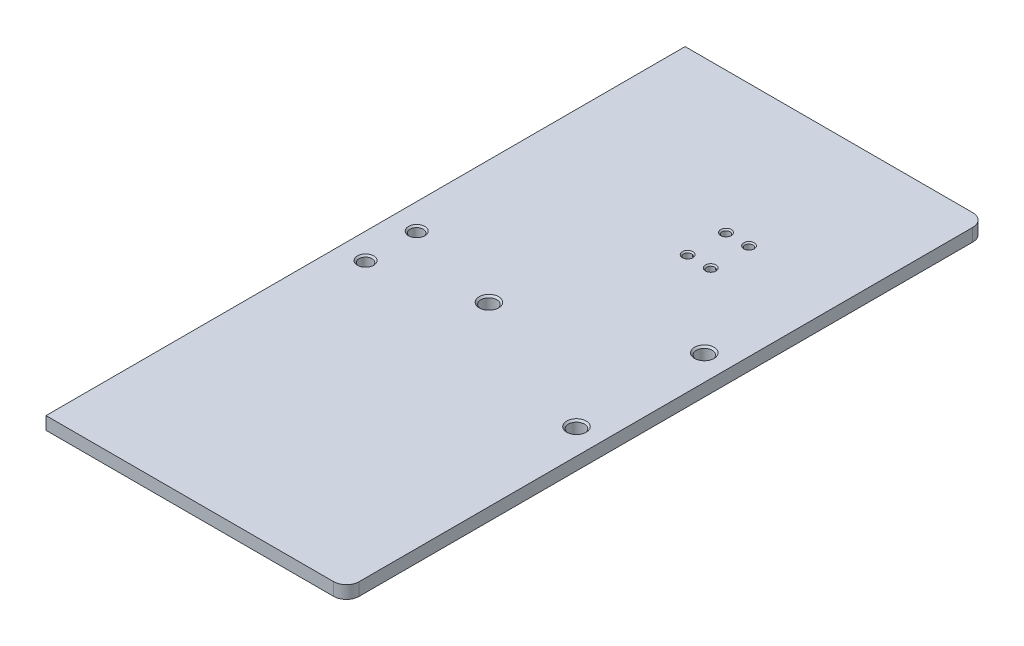
ISO-10303-21;
HEADER;
FILE_DESCRIPTION(('STEP AP214'),'2;1');
FILE_NAME('part.step','',(''),(''),'','','');
FILE_SCHEMA(('AUTOMOTIVE_DESIGN { 1 0 10303 214 1 1 1 1 }'));
ENDSEC;
DATA;
#1=APPLICATION_CONTEXT('core data for automotive mechanical design processes');
#2=APPLICATION_PROTOCOL_DEFINITION('international standard','automotive_design',2000,#1);
#3=PRODUCT_CONTEXT('',#1,'mechanical');
#4=PRODUCT('Part','Part','',(#3));
#5=PRODUCT_RELATED_PRODUCT_CATEGORY('part','',(#4));
#6=PRODUCT_DEFINITION_FORMATION('','',#4);
#7=PRODUCT_DEFINITION_CONTEXT('part definition',#1,'design');
#8=PRODUCT_DEFINITION('design','',#6,#7);
#9=PRODUCT_DEFINITION_SHAPE('','',#8);
#10=(LENGTH_UNIT() NAMED_UNIT(*) SI_UNIT(.MILLI.,.METRE.));
#11=(NAMED_UNIT(*) PLANE_ANGLE_UNIT() SI_UNIT($,.RADIAN.));
#12=(NAMED_UNIT(*) SI_UNIT($,.STERADIAN.) SOLID_ANGLE_UNIT());
#13=UNCERTAINTY_MEASURE_WITH_UNIT(LENGTH_MEASURE(1.E-05),#10,'distance_accuracy_value','');
#14=(GEOMETRIC_REPRESENTATION_CONTEXT(3) GLOBAL_UNCERTAINTY_ASSIGNED_CONTEXT((#13)) GLOBAL_UNIT_ASSIGNED_CONTEXT((#10,
#11,#12)) REPRESENTATION_CONTEXT('',''));
#15=CARTESIAN_POINT('',(0.,0.,0.));
#16=DIRECTION('',(0.,0.,1.));
#17=DIRECTION('',(1.,0.,0.));
#18=AXIS2_PLACEMENT_3D('',#15,#16,#17);
#19=CARTESIAN_POINT('',(0.,0.,0.));
#20=DIRECTION('',(0.,-1.,0.));
#21=DIRECTION('',(0.,0.,-1.));
#22=AXIS2_PLACEMENT_3D('',#19,#20,#21);
#23=PLANE('',#22);
#24=CARTESIAN_POINT('',(-18.,0.,-4.));
#25=DIRECTION('',(0.,1.,0.));
#26=DIRECTION('',(0.,0.,1.));
#27=AXIS2_PLACEMENT_3D('',#24,#25,#26);
#28=CIRCLE('',#27,1.02499999999999);
#29=CARTESIAN_POINT('',(-18.,0.,-2.97500000000001));
#30=VERTEX_POINT('',#29);
#31=EDGE_CURVE('E278',#30,#30,#28,.T.);
#32=ORIENTED_EDGE('',*,*,#31,.T.);
#33=EDGE_LOOP('',(#32));
#34=FACE_BOUND('',#33,.T.);
#35=CARTESIAN_POINT('',(-18.,0.,4.));
#36=DIRECTION('',(0.,1.,0.));
#37=DIRECTION('',(0.,0.,1.));
#38=AXIS2_PLACEMENT_3D('',#35,#36,#37);
#39=CIRCLE('',#38,1.02499999999999);
#40=CARTESIAN_POINT('',(-18.,0.,5.02499999999999));
#41=VERTEX_POINT('',#40);
#42=EDGE_CURVE('E164',#41,#41,#39,.T.);
#43=ORIENTED_EDGE('',*,*,#42,.T.);
#44=EDGE_LOOP('',(#43));
#45=FACE_BOUND('',#44,.T.);
#46=DIRECTION('',(0.,0.,-1.));
#47=VECTOR('',#46,1.);
#48=CARTESIAN_POINT('',(-22.,0.,50.));
#49=LINE('',#48,#47);
#50=CARTESIAN_POINT('',(-22.,0.,50.));
#51=VERTEX_POINT('',#50);
#52=CARTESIAN_POINT('',(-22.,0.,-50.));
#53=VERTEX_POINT('',#52);
#54=EDGE_CURVE('E110',#51,#53,#49,.T.);
#55=ORIENTED_EDGE('',*,*,#54,.T.);
#56=DIRECTION('',(-1.,0.,0.));
#57=VECTOR('',#56,1.);
#58=CARTESIAN_POINT('',(-25.,0.,-50.));
#59=LINE('',#58,#57);
#60=CARTESIAN_POINT('',(23.,0.,-50.));
#61=VERTEX_POINT('',#60);
#62=EDGE_CURVE('E161',#61,#53,#59,.T.);
#63=ORIENTED_EDGE('',*,*,#62,.F.);
#64=CARTESIAN_POINT('',(23.,0.,-48.));
#65=DIRECTION('',(0.,-1.,0.));
#66=DIRECTION('',(0.,0.,-1.));
#67=AXIS2_PLACEMENT_3D('',#64,#65,#66);
#68=CIRCLE('',#67,2.);
#69=CARTESIAN_POINT('',(25.,0.,-48.));
#70=VERTEX_POINT('',#69);
#71=EDGE_CURVE('E183',#61,#70,#68,.T.);
#72=ORIENTED_EDGE('',*,*,#71,.T.);
#73=DIRECTION('',(0.,0.,-1.));
#74=VECTOR('',#73,1.);
#75=CARTESIAN_POINT('',(25.,0.,50.));
#76=LINE('',#75,#74);
#77=CARTESIAN_POINT('',(25.,0.,48.));
#78=VERTEX_POINT('',#77);
#79=EDGE_CURVE('E170',#78,#70,#76,.T.);
#80=ORIENTED_EDGE('',*,*,#79,.F.);
#81=CARTESIAN_POINT('',(23.,0.,48.));
#82=DIRECTION('',(0.,-1.,0.));
#83=DIRECTION('',(0.,0.,-1.));
#84=AXIS2_PLACEMENT_3D('',#81,#82,#83);
#85=CIRCLE('',#84,2.);
#86=CARTESIAN_POINT('',(23.,0.,50.));
#87=VERTEX_POINT('',#86);
#88=EDGE_CURVE('E181',#78,#87,#85,.T.);
#89=ORIENTED_EDGE('',*,*,#88,.T.);
#90=DIRECTION('',(1.,0.,0.));
#91=VECTOR('',#90,1.);
#92=CARTESIAN_POINT('',(-25.,0.,50.));
#93=LINE('',#92,#91);
#94=EDGE_CURVE('E163',#51,#87,#93,.T.);
#95=ORIENTED_EDGE('',*,*,#94,.F.);
#96=EDGE_LOOP('',(#55,#63,#72,#80,#89,#95));
#97=FACE_BOUND('',#96,.T.);
#98=CARTESIAN_POINT('',(6.40000000000001,0.,-22.));
#99=DIRECTION('',(0.,1.,0.));
#100=DIRECTION('',(0.,0.,1.));
#101=AXIS2_PLACEMENT_3D('',#98,#99,#100);
#102=CIRCLE('',#101,0.624999999999999);
#103=CARTESIAN_POINT('',(6.40000000000001,0.,-21.375));
#104=VERTEX_POINT('',#103);
#105=EDGE_CURVE('E260',#104,#104,#102,.T.);
#106=ORIENTED_EDGE('',*,*,#105,.T.);
#107=EDGE_LOOP('',(#106));
#108=FACE_BOUND('',#107,.T.);
#109=CARTESIAN_POINT('',(21.,0.,10.));
#110=DIRECTION('',(0.,-1.,0.));
#111=DIRECTION('',(0.,0.,-1.));
#112=AXIS2_PLACEMENT_3D('',#109,#110,#111);
#113=CIRCLE('',#112,1.24999999999999);
#114=CARTESIAN_POINT('',(21.,0.,8.75000000000001));
#115=VERTEX_POINT('',#114);
#116=EDGE_CURVE('E206',#115,#115,#113,.T.);
#117=ORIENTED_EDGE('',*,*,#116,.F.);
#118=EDGE_LOOP('',(#117));
#119=FACE_BOUND('',#118,.T.);
#120=CARTESIAN_POINT('',(21.,0.,-10.));
#121=DIRECTION('',(0.,-1.,0.));
#122=DIRECTION('',(0.,0.,-1.));
#123=AXIS2_PLACEMENT_3D('',#120,#121,#122);
#124=CIRCLE('',#123,1.24999999999999);
#125=CARTESIAN_POINT('',(21.,0.,-11.25));
#126=VERTEX_POINT('',#125);
#127=EDGE_CURVE('E215',#126,#126,#124,.T.);
#128=ORIENTED_EDGE('',*,*,#127,.F.);
#129=EDGE_LOOP('',(#128));
#130=FACE_BOUND('',#129,.T.);
#131=CARTESIAN_POINT('',(-2.69999999999999,0.,0.));
#132=DIRECTION('',(0.,-1.,0.));
#133=DIRECTION('',(0.,0.,-1.));
#134=AXIS2_PLACEMENT_3D('',#131,#132,#133);
#135=CIRCLE('',#134,1.24999999999999);
#136=CARTESIAN_POINT('',(-2.69999999999999,0.,-1.24999999999999));
#137=VERTEX_POINT('',#136);
#138=EDGE_CURVE('E224',#137,#137,#135,.T.);
#139=ORIENTED_EDGE('',*,*,#138,.F.);
#140=EDGE_LOOP('',(#139));
#141=FACE_BOUND('',#140,.T.);
#142=CARTESIAN_POINT('',(10.,0.,-28.));
#143=DIRECTION('',(0.,1.,0.));
#144=DIRECTION('',(0.,0.,1.));
#145=AXIS2_PLACEMENT_3D('',#142,#143,#144);
#146=CIRCLE('',#145,0.624999999999999);
#147=CARTESIAN_POINT('',(10.,0.,-27.375));
#148=VERTEX_POINT('',#147);
#149=EDGE_CURVE('E233',#148,#148,#146,.T.);
#150=ORIENTED_EDGE('',*,*,#149,.T.);
#151=EDGE_LOOP('',(#150));
#152=FACE_BOUND('',#151,.T.);
#153=CARTESIAN_POINT('',(6.40000000000001,0.,-28.));
#154=DIRECTION('',(0.,1.,0.));
#155=DIRECTION('',(0.,0.,1.));
#156=AXIS2_PLACEMENT_3D('',#153,#154,#155);
#157=CIRCLE('',#156,0.624999999999999);
#158=CARTESIAN_POINT('',(6.40000000000001,0.,-27.375));
#159=VERTEX_POINT('',#158);
#160=EDGE_CURVE('E242',#159,#159,#157,.T.);
#161=ORIENTED_EDGE('',*,*,#160,.T.);
#162=EDGE_LOOP('',(#161));
#163=FACE_BOUND('',#162,.T.);
#164=CARTESIAN_POINT('',(10.,0.,-22.));
#165=DIRECTION('',(0.,1.,0.));
#166=DIRECTION('',(0.,0.,1.));
#167=AXIS2_PLACEMENT_3D('',#164,#165,#166);
#168=CIRCLE('',#167,0.624999999999999);
#169=CARTESIAN_POINT('',(10.,0.,-21.375));
#170=VERTEX_POINT('',#169);
#171=EDGE_CURVE('E251',#170,#170,#168,.T.);
#172=ORIENTED_EDGE('',*,*,#171,.T.);
#173=EDGE_LOOP('',(#172));
#174=FACE_BOUND('',#173,.T.);
#175=ADVANCED_FACE('F95',(#34,#45,#97,#108,#119,#130,#141,#152,#163,#174),#23,.T.);
#176=CARTESIAN_POINT('',(-25.,2.,-50.));
#177=DIRECTION('',(0.,0.,1.));
#178=DIRECTION('',(1.,0.,0.));
#179=AXIS2_PLACEMENT_3D('',#176,#177,#178);
#180=PLANE('',#179);
#181=ORIENTED_EDGE('',*,*,#62,.T.);
#182=DIRECTION('',(0.,1.,0.));
#183=VECTOR('',#182,1.);
#184=CARTESIAN_POINT('',(-22.,0.,-50.));
#185=LINE('',#184,#183);
#186=CARTESIAN_POINT('',(-22.,2.,-50.));
#187=VERTEX_POINT('',#186);
#188=EDGE_CURVE('E147',#53,#187,#185,.T.);
#189=ORIENTED_EDGE('',*,*,#188,.T.);
#190=DIRECTION('',(-1.,0.,0.));
#191=VECTOR('',#190,1.);
#192=CARTESIAN_POINT('',(-25.,2.,-50.));
#193=LINE('',#192,#191);
#194=CARTESIAN_POINT('',(23.,2.,-50.));
#195=VERTEX_POINT('',#194);
#196=EDGE_CURVE('E199',#195,#187,#193,.T.);
#197=ORIENTED_EDGE('',*,*,#196,.F.);
#198=DIRECTION('',(0.,-1.,0.));
#199=VECTOR('',#198,1.);
#200=CARTESIAN_POINT('',(23.,2.,-50.));
#201=LINE('',#200,#199);
#202=EDGE_CURVE('E169',#195,#61,#201,.T.);
#203=ORIENTED_EDGE('',*,*,#202,.T.);
#204=EDGE_LOOP('',(#181,#189,#197,#203));
#205=FACE_BOUND('',#204,.T.);
#206=ADVANCED_FACE('F167',(#205),#180,.F.);
#207=CARTESIAN_POINT('',(0.,2.,0.));
#208=DIRECTION('',(0.,-1.,0.));
#209=DIRECTION('',(0.,0.,-1.));
#210=AXIS2_PLACEMENT_3D('',#207,#208,#209);
#211=PLANE('',#210);
#212=CARTESIAN_POINT('',(-18.,2.,-4.));
#213=DIRECTION('',(0.,1.,0.));
#214=DIRECTION('',(0.,0.,1.));
#215=AXIS2_PLACEMENT_3D('',#212,#213,#214);
#216=CIRCLE('',#215,1.275);
#217=CARTESIAN_POINT('',(-18.,2.,-2.725));
#218=VERTEX_POINT('',#217);
#219=EDGE_CURVE('E284',#218,#218,#216,.T.);
#220=ORIENTED_EDGE('',*,*,#219,.F.);
#221=EDGE_LOOP('',(#220));
#222=FACE_BOUND('',#221,.T.);
#223=CARTESIAN_POINT('',(-18.,2.,4.));
#224=DIRECTION('',(0.,1.,0.));
#225=DIRECTION('',(0.,0.,1.));
#226=AXIS2_PLACEMENT_3D('',#223,#224,#225);
#227=CIRCLE('',#226,1.275);
#228=CARTESIAN_POINT('',(-18.,2.,5.275));
#229=VERTEX_POINT('',#228);
#230=EDGE_CURVE('E275',#229,#229,#227,.T.);
#231=ORIENTED_EDGE('',*,*,#230,.F.);
#232=EDGE_LOOP('',(#231));
#233=FACE_BOUND('',#232,.T.);
#234=CARTESIAN_POINT('',(6.40000000000001,2.,-22.));
#235=DIRECTION('',(0.,1.,0.));
#236=DIRECTION('',(0.,0.,1.));
#237=AXIS2_PLACEMENT_3D('',#234,#235,#236);
#238=CIRCLE('',#237,0.824999999999999);
#239=CARTESIAN_POINT('',(6.40000000000001,2.,-21.175));
#240=VERTEX_POINT('',#239);
#241=EDGE_CURVE('E266',#240,#240,#238,.T.);
#242=ORIENTED_EDGE('',*,*,#241,.F.);
#243=EDGE_LOOP('',(#242));
#244=FACE_BOUND('',#243,.T.);
#245=CARTESIAN_POINT('',(10.,2.,-22.));
#246=DIRECTION('',(0.,1.,0.));
#247=DIRECTION('',(0.,0.,1.));
#248=AXIS2_PLACEMENT_3D('',#245,#246,#247);
#249=CIRCLE('',#248,0.824999999999999);
#250=CARTESIAN_POINT('',(10.,2.,-21.175));
#251=VERTEX_POINT('',#250);
#252=EDGE_CURVE('E257',#251,#251,#249,.T.);
#253=ORIENTED_EDGE('',*,*,#252,.F.);
#254=EDGE_LOOP('',(#253));
#255=FACE_BOUND('',#254,.T.);
#256=CARTESIAN_POINT('',(6.40000000000001,2.,-28.));
#257=DIRECTION('',(0.,1.,0.));
#258=DIRECTION('',(0.,0.,1.));
#259=AXIS2_PLACEMENT_3D('',#256,#257,#258);
#260=CIRCLE('',#259,0.824999999999999);
#261=CARTESIAN_POINT('',(6.40000000000001,2.,-27.175));
#262=VERTEX_POINT('',#261);
#263=EDGE_CURVE('E248',#262,#262,#260,.T.);
#264=ORIENTED_EDGE('',*,*,#263,.F.);
#265=EDGE_LOOP('',(#264));
#266=FACE_BOUND('',#265,.T.);
#267=CARTESIAN_POINT('',(10.,2.,-28.));
#268=DIRECTION('',(0.,1.,0.));
#269=DIRECTION('',(0.,0.,1.));
#270=AXIS2_PLACEMENT_3D('',#267,#268,#269);
#271=CIRCLE('',#270,0.824999999999999);
#272=CARTESIAN_POINT('',(10.,2.,-27.175));
#273=VERTEX_POINT('',#272);
#274=EDGE_CURVE('E239',#273,#273,#271,.T.);
#275=ORIENTED_EDGE('',*,*,#274,.F.);
#276=EDGE_LOOP('',(#275));
#277=FACE_BOUND('',#276,.T.);
#278=CARTESIAN_POINT('',(-2.69999999999999,2.,0.));
#279=DIRECTION('',(0.,1.,0.));
#280=DIRECTION('',(0.,0.,1.));
#281=AXIS2_PLACEMENT_3D('',#278,#279,#280);
#282=CIRCLE('',#281,1.525);
#283=CARTESIAN_POINT('',(-2.69999999999999,2.,1.525));
#284=VERTEX_POINT('',#283);
#285=EDGE_CURVE('E230',#284,#284,#282,.T.);
#286=ORIENTED_EDGE('',*,*,#285,.F.);
#287=EDGE_LOOP('',(#286));
#288=FACE_BOUND('',#287,.T.);
#289=CARTESIAN_POINT('',(21.,2.,-10.));
#290=DIRECTION('',(0.,1.,0.));
#291=DIRECTION('',(0.,0.,1.));
#292=AXIS2_PLACEMENT_3D('',#289,#290,#291);
#293=CIRCLE('',#292,1.525);
#294=CARTESIAN_POINT('',(21.,2.,-8.475));
#295=VERTEX_POINT('',#294);
#296=EDGE_CURVE('E221',#295,#295,#293,.T.);
#297=ORIENTED_EDGE('',*,*,#296,.F.);
#298=EDGE_LOOP('',(#297));
#299=FACE_BOUND('',#298,.T.);
#300=CARTESIAN_POINT('',(21.,2.,10.));
#301=DIRECTION('',(0.,1.,0.));
#302=DIRECTION('',(0.,0.,1.));
#303=AXIS2_PLACEMENT_3D('',#300,#301,#302);
#304=CIRCLE('',#303,1.525);
#305=CARTESIAN_POINT('',(21.,2.,11.525));
#306=VERTEX_POINT('',#305);
#307=EDGE_CURVE('E212',#306,#306,#304,.T.);
#308=ORIENTED_EDGE('',*,*,#307,.F.);
#309=EDGE_LOOP('',(#308));
#310=FACE_BOUND('',#309,.T.);
#311=DIRECTION('',(0.,0.,-1.));
#312=VECTOR('',#311,1.);
#313=CARTESIAN_POINT('',(25.,2.,50.));
#314=LINE('',#313,#312);
#315=CARTESIAN_POINT('',(25.,2.,48.));
#316=VERTEX_POINT('',#315);
#317=CARTESIAN_POINT('',(25.,2.,-48.));
#318=VERTEX_POINT('',#317);
#319=EDGE_CURVE('E172',#316,#318,#314,.T.);
#320=ORIENTED_EDGE('',*,*,#319,.T.);
#321=CARTESIAN_POINT('',(23.,2.,-48.));
#322=DIRECTION('',(0.,-1.,0.));
#323=DIRECTION('',(0.,0.,-1.));
#324=AXIS2_PLACEMENT_3D('',#321,#322,#323);
#325=CIRCLE('',#324,2.);
#326=EDGE_CURVE('E12',#318,#195,#325,.F.);
#327=ORIENTED_EDGE('',*,*,#326,.T.);
#328=ORIENTED_EDGE('',*,*,#196,.T.);
#329=DIRECTION('',(0.,0.,-1.));
#330=VECTOR('',#329,1.);
#331=CARTESIAN_POINT('',(-22.,2.,-50.));
#332=LINE('',#331,#330);
#333=CARTESIAN_POINT('',(-22.,2.,50.));
#334=VERTEX_POINT('',#333);
#335=EDGE_CURVE('E150',#334,#187,#332,.T.);
#336=ORIENTED_EDGE('',*,*,#335,.F.);
#337=DIRECTION('',(1.,0.,0.));
#338=VECTOR('',#337,1.);
#339=CARTESIAN_POINT('',(-25.,2.,50.));
#340=LINE('',#339,#338);
#341=CARTESIAN_POINT('',(23.,2.,50.));
#342=VERTEX_POINT('',#341);
#343=EDGE_CURVE('E179',#334,#342,#340,.T.);
#344=ORIENTED_EDGE('',*,*,#343,.T.);
#345=CARTESIAN_POINT('',(23.,2.,48.));
#346=DIRECTION('',(0.,-1.,0.));
#347=DIRECTION('',(0.,0.,-1.));
#348=AXIS2_PLACEMENT_3D('',#345,#346,#347);
#349=CIRCLE('',#348,2.);
#350=EDGE_CURVE('E103',#342,#316,#349,.F.);
#351=ORIENTED_EDGE('',*,*,#350,.T.);
#352=EDGE_LOOP('',(#320,#327,#328,#336,#344,#351));
#353=FACE_BOUND('',#352,.T.);
#354=ADVANCED_FACE('F191',(#222,#233,#244,#255,#266,#277,#288,#299,#310,#353),#211,.F.);
#355=CARTESIAN_POINT('',(25.,2.,50.));
#356=DIRECTION('',(-1.,0.,0.));
#357=DIRECTION('',(0.,0.,1.));
#358=AXIS2_PLACEMENT_3D('',#355,#356,#357);
#359=PLANE('',#358);
#360=ORIENTED_EDGE('',*,*,#79,.T.);
#361=DIRECTION('',(0.,-1.,0.));
#362=VECTOR('',#361,1.);
#363=CARTESIAN_POINT('',(25.,2.,-48.));
#364=LINE('',#363,#362);
#365=EDGE_CURVE('E118',#70,#318,#364,.F.);
#366=ORIENTED_EDGE('',*,*,#365,.T.);
#367=ORIENTED_EDGE('',*,*,#319,.F.);
#368=DIRECTION('',(0.,-1.,0.));
#369=VECTOR('',#368,1.);
#370=CARTESIAN_POINT('',(25.,2.,48.));
#371=LINE('',#370,#369);
#372=EDGE_CURVE('E185',#316,#78,#371,.T.);
#373=ORIENTED_EDGE('',*,*,#372,.T.);
#374=EDGE_LOOP('',(#360,#366,#367,#373));
#375=FACE_BOUND('',#374,.T.);
#376=ADVANCED_FACE('F197',(#375),#359,.F.);
#377=CARTESIAN_POINT('',(-25.,2.,50.));
#378=DIRECTION('',(0.,0.,-1.));
#379=DIRECTION('',(-1.,0.,0.));
#380=AXIS2_PLACEMENT_3D('',#377,#378,#379);
#381=PLANE('',#380);
#382=ORIENTED_EDGE('',*,*,#343,.F.);
#383=DIRECTION('',(0.,1.,0.));
#384=VECTOR('',#383,1.);
#385=CARTESIAN_POINT('',(-22.,0.,50.));
#386=LINE('',#385,#384);
#387=EDGE_CURVE('E155',#51,#334,#386,.T.);
#388=ORIENTED_EDGE('',*,*,#387,.F.);
#389=ORIENTED_EDGE('',*,*,#94,.T.);
#390=DIRECTION('',(0.,-1.,0.));
#391=VECTOR('',#390,1.);
#392=CARTESIAN_POINT('',(23.,2.,50.));
#393=LINE('',#392,#391);
#394=EDGE_CURVE('E177',#87,#342,#393,.F.);
#395=ORIENTED_EDGE('',*,*,#394,.T.);
#396=EDGE_LOOP('',(#382,#388,#389,#395));
#397=FACE_BOUND('',#396,.T.);
#398=ADVANCED_FACE('F337',(#397),#381,.F.);
#399=CARTESIAN_POINT('',(23.,2.,-48.));
#400=DIRECTION('',(0.,-1.,0.));
#401=DIRECTION('',(0.,0.,-1.));
#402=AXIS2_PLACEMENT_3D('',#399,#400,#401);
#403=CYLINDRICAL_SURFACE('',#402,2.);
#404=ORIENTED_EDGE('',*,*,#326,.F.);
#405=ORIENTED_EDGE('',*,*,#365,.F.);
#406=ORIENTED_EDGE('',*,*,#71,.F.);
#407=ORIENTED_EDGE('',*,*,#202,.F.);
#408=EDGE_LOOP('',(#404,#405,#406,#407));
#409=FACE_BOUND('',#408,.T.);
#410=ADVANCED_FACE('F202',(#409),#403,.T.);
#411=CARTESIAN_POINT('',(23.,2.,48.));
#412=DIRECTION('',(0.,-1.,0.));
#413=DIRECTION('',(0.,0.,-1.));
#414=AXIS2_PLACEMENT_3D('',#411,#412,#413);
#415=CYLINDRICAL_SURFACE('',#414,2.);
#416=ORIENTED_EDGE('',*,*,#350,.F.);
#417=ORIENTED_EDGE('',*,*,#394,.F.);
#418=ORIENTED_EDGE('',*,*,#88,.F.);
#419=ORIENTED_EDGE('',*,*,#372,.F.);
#420=EDGE_LOOP('',(#416,#417,#418,#419));
#421=FACE_BOUND('',#420,.T.);
#422=ADVANCED_FACE('F97',(#421),#415,.T.);
#423=CARTESIAN_POINT('',(21.,2.,10.));
#424=DIRECTION('',(0.,1.,0.));
#425=DIRECTION('',(0.,0.,1.));
#426=AXIS2_PLACEMENT_3D('',#423,#424,#425);
#427=CYLINDRICAL_SURFACE('',#426,1.24999999999999);
#428=CARTESIAN_POINT('',(21.,1.72499999999999,10.));
#429=DIRECTION('',(0.,1.,0.));
#430=DIRECTION('',(0.,0.,1.));
#431=AXIS2_PLACEMENT_3D('',#428,#429,#430);
#432=CIRCLE('',#431,1.24999999999999);
#433=CARTESIAN_POINT('',(21.,1.72499999999999,11.25));
#434=VERTEX_POINT('',#433);
#435=EDGE_CURVE('E209',#434,#434,#432,.T.);
#436=ORIENTED_EDGE('',*,*,#435,.T.);
#437=EDGE_LOOP('',(#436));
#438=FACE_BOUND('',#437,.T.);
#439=ORIENTED_EDGE('',*,*,#116,.T.);
#440=EDGE_LOOP('',(#439));
#441=FACE_BOUND('',#440,.T.);
#442=ADVANCED_FACE('F312',(#438,#441),#427,.F.);
#443=CARTESIAN_POINT('',(21.,2.,10.));
#444=DIRECTION('',(0.,1.,0.));
#445=DIRECTION('',(0.,0.,1.));
#446=AXIS2_PLACEMENT_3D('',#443,#444,#445);
#447=CONICAL_SURFACE('',#446,1.525,0.785398163397451);
#448=ORIENTED_EDGE('',*,*,#435,.F.);
#449=EDGE_LOOP('',(#448));
#450=FACE_BOUND('',#449,.T.);
#451=ORIENTED_EDGE('',*,*,#307,.T.);
#452=EDGE_LOOP('',(#451));
#453=FACE_BOUND('',#452,.T.);
#454=ADVANCED_FACE('F309',(#450,#453),#447,.F.);
#455=CARTESIAN_POINT('',(21.,2.,-10.));
#456=DIRECTION('',(0.,1.,0.));
#457=DIRECTION('',(0.,0.,1.));
#458=AXIS2_PLACEMENT_3D('',#455,#456,#457);
#459=CYLINDRICAL_SURFACE('',#458,1.24999999999999);
#460=CARTESIAN_POINT('',(21.,1.72499999999999,-10.));
#461=DIRECTION('',(0.,1.,0.));
#462=DIRECTION('',(0.,0.,1.));
#463=AXIS2_PLACEMENT_3D('',#460,#461,#462);
#464=CIRCLE('',#463,1.24999999999999);
#465=CARTESIAN_POINT('',(21.,1.72499999999999,-8.75000000000001));
#466=VERTEX_POINT('',#465);
#467=EDGE_CURVE('E218',#466,#466,#464,.T.);
#468=ORIENTED_EDGE('',*,*,#467,.T.);
#469=EDGE_LOOP('',(#468));
#470=FACE_BOUND('',#469,.T.);
#471=ORIENTED_EDGE('',*,*,#127,.T.);
#472=EDGE_LOOP('',(#471));
#473=FACE_BOUND('',#472,.T.);
#474=ADVANCED_FACE('F311',(#470,#473),#459,.F.);
#475=CARTESIAN_POINT('',(21.,2.,-10.));
#476=DIRECTION('',(0.,1.,0.));
#477=DIRECTION('',(0.,0.,1.));
#478=AXIS2_PLACEMENT_3D('',#475,#476,#477);
#479=CONICAL_SURFACE('',#478,1.525,0.785398163397451);
#480=ORIENTED_EDGE('',*,*,#467,.F.);
#481=EDGE_LOOP('',(#480));
#482=FACE_BOUND('',#481,.T.);
#483=ORIENTED_EDGE('',*,*,#296,.T.);
#484=EDGE_LOOP('',(#483));
#485=FACE_BOUND('',#484,.T.);
#486=ADVANCED_FACE('F320',(#482,#485),#479,.F.);
#487=CARTESIAN_POINT('',(-2.69999999999999,2.,0.));
#488=DIRECTION('',(0.,1.,0.));
#489=DIRECTION('',(0.,0.,1.));
#490=AXIS2_PLACEMENT_3D('',#487,#488,#489);
#491=CYLINDRICAL_SURFACE('',#490,1.24999999999999);
#492=CARTESIAN_POINT('',(-2.69999999999999,1.72499999999999,0.));
#493=DIRECTION('',(0.,1.,0.));
#494=DIRECTION('',(0.,0.,1.));
#495=AXIS2_PLACEMENT_3D('',#492,#493,#494);
#496=CIRCLE('',#495,1.24999999999999);
#497=CARTESIAN_POINT('',(-2.69999999999999,1.72499999999999,1.24999999999999));
#498=VERTEX_POINT('',#497);
#499=EDGE_CURVE('E227',#498,#498,#496,.T.);
#500=ORIENTED_EDGE('',*,*,#499,.T.);
#501=EDGE_LOOP('',(#500));
#502=FACE_BOUND('',#501,.T.);
#503=ORIENTED_EDGE('',*,*,#138,.T.);
#504=EDGE_LOOP('',(#503));
#505=FACE_BOUND('',#504,.T.);
#506=ADVANCED_FACE('F479',(#502,#505),#491,.F.);
#507=CARTESIAN_POINT('',(-2.69999999999999,2.,0.));
#508=DIRECTION('',(0.,1.,0.));
#509=DIRECTION('',(0.,0.,1.));
#510=AXIS2_PLACEMENT_3D('',#507,#508,#509);
#511=CONICAL_SURFACE('',#510,1.525,0.785398163397448);
#512=ORIENTED_EDGE('',*,*,#499,.F.);
#513=EDGE_LOOP('',(#512));
#514=FACE_BOUND('',#513,.T.);
#515=ORIENTED_EDGE('',*,*,#285,.T.);
#516=EDGE_LOOP('',(#515));
#517=FACE_BOUND('',#516,.T.);
#518=ADVANCED_FACE('F367',(#514,#517),#511,.F.);
#519=CARTESIAN_POINT('',(10.,2.,-28.));
#520=DIRECTION('',(0.,1.,0.));
#521=DIRECTION('',(0.,0.,1.));
#522=AXIS2_PLACEMENT_3D('',#519,#520,#521);
#523=CYLINDRICAL_SURFACE('',#522,0.624999999999999);
#524=ORIENTED_EDGE('',*,*,#149,.F.);
#525=EDGE_LOOP('',(#524));
#526=FACE_BOUND('',#525,.T.);
#527=CARTESIAN_POINT('',(10.,1.8,-28.));
#528=DIRECTION('',(0.,1.,0.));
#529=DIRECTION('',(0.,0.,1.));
#530=AXIS2_PLACEMENT_3D('',#527,#528,#529);
#531=CIRCLE('',#530,0.624999999999999);
#532=CARTESIAN_POINT('',(10.,1.8,-27.375));
#533=VERTEX_POINT('',#532);
#534=EDGE_CURVE('E236',#533,#533,#531,.T.);
#535=ORIENTED_EDGE('',*,*,#534,.T.);
#536=EDGE_LOOP('',(#535));
#537=FACE_BOUND('',#536,.T.);
#538=ADVANCED_FACE('F362',(#526,#537),#523,.F.);
#539=CARTESIAN_POINT('',(10.,2.,-28.));
#540=DIRECTION('',(0.,1.,0.));
#541=DIRECTION('',(0.,0.,1.));
#542=AXIS2_PLACEMENT_3D('',#539,#540,#541);
#543=CONICAL_SURFACE('',#542,0.824999999999999,0.785398163397444);
#544=ORIENTED_EDGE('',*,*,#534,.F.);
#545=EDGE_LOOP('',(#544));
#546=FACE_BOUND('',#545,.T.);
#547=ORIENTED_EDGE('',*,*,#274,.T.);
#548=EDGE_LOOP('',(#547));
#549=FACE_BOUND('',#548,.T.);
#550=ADVANCED_FACE('F366',(#546,#549),#543,.F.);
#551=CARTESIAN_POINT('',(6.40000000000001,2.,-28.));
#552=DIRECTION('',(0.,1.,0.));
#553=DIRECTION('',(0.,0.,1.));
#554=AXIS2_PLACEMENT_3D('',#551,#552,#553);
#555=CYLINDRICAL_SURFACE('',#554,0.624999999999999);
#556=ORIENTED_EDGE('',*,*,#160,.F.);
#557=EDGE_LOOP('',(#556));
#558=FACE_BOUND('',#557,.T.);
#559=CARTESIAN_POINT('',(6.40000000000001,1.8,-28.));
#560=DIRECTION('',(0.,1.,0.));
#561=DIRECTION('',(0.,0.,1.));
#562=AXIS2_PLACEMENT_3D('',#559,#560,#561);
#563=CIRCLE('',#562,0.624999999999999);
#564=CARTESIAN_POINT('',(6.40000000000001,1.8,-27.375));
#565=VERTEX_POINT('',#564);
#566=EDGE_CURVE('E245',#565,#565,#563,.T.);
#567=ORIENTED_EDGE('',*,*,#566,.T.);
#568=EDGE_LOOP('',(#567));
#569=FACE_BOUND('',#568,.T.);
#570=ADVANCED_FACE('F374',(#558,#569),#555,.F.);
#571=CARTESIAN_POINT('',(6.40000000000001,2.,-28.));
#572=DIRECTION('',(0.,1.,0.));
#573=DIRECTION('',(0.,0.,1.));
#574=AXIS2_PLACEMENT_3D('',#571,#572,#573);
#575=CONICAL_SURFACE('',#574,0.824999999999999,0.785398163397444);
#576=ORIENTED_EDGE('',*,*,#566,.F.);
#577=EDGE_LOOP('',(#576));
#578=FACE_BOUND('',#577,.T.);
#579=ORIENTED_EDGE('',*,*,#263,.T.);
#580=EDGE_LOOP('',(#579));
#581=FACE_BOUND('',#580,.T.);
#582=ADVANCED_FACE('F378',(#578,#581),#575,.F.);
#583=CARTESIAN_POINT('',(10.,2.,-22.));
#584=DIRECTION('',(0.,1.,0.));
#585=DIRECTION('',(0.,0.,1.));
#586=AXIS2_PLACEMENT_3D('',#583,#584,#585);
#587=CYLINDRICAL_SURFACE('',#586,0.624999999999994);
#588=ORIENTED_EDGE('',*,*,#171,.F.);
#589=EDGE_LOOP('',(#588));
#590=FACE_BOUND('',#589,.T.);
#591=CARTESIAN_POINT('',(10.,1.79999999999999,-22.));
#592=DIRECTION('',(0.,1.,0.));
#593=DIRECTION('',(0.,0.,1.));
#594=AXIS2_PLACEMENT_3D('',#591,#592,#593);
#595=CIRCLE('',#594,0.624999999999988);
#596=CARTESIAN_POINT('',(10.,1.79999999999999,-21.375));
#597=VERTEX_POINT('',#596);
#598=EDGE_CURVE('E254',#597,#597,#595,.T.);
#599=ORIENTED_EDGE('',*,*,#598,.T.);
#600=EDGE_LOOP('',(#599));
#601=FACE_BOUND('',#600,.T.);
#602=ADVANCED_FACE('F384',(#590,#601),#587,.F.);
#603=CARTESIAN_POINT('',(10.,2.,-22.));
#604=DIRECTION('',(0.,1.,0.));
#605=DIRECTION('',(0.,0.,1.));
#606=AXIS2_PLACEMENT_3D('',#603,#604,#605);
#607=CONICAL_SURFACE('',#606,0.824999999999999,0.785398163397457);
#608=ORIENTED_EDGE('',*,*,#598,.F.);
#609=EDGE_LOOP('',(#608));
#610=FACE_BOUND('',#609,.T.);
#611=ORIENTED_EDGE('',*,*,#252,.T.);
#612=EDGE_LOOP('',(#611));
#613=FACE_BOUND('',#612,.T.);
#614=ADVANCED_FACE('F388',(#610,#613),#607,.F.);
#615=CARTESIAN_POINT('',(6.40000000000001,2.,-22.));
#616=DIRECTION('',(0.,1.,0.));
#617=DIRECTION('',(0.,0.,1.));
#618=AXIS2_PLACEMENT_3D('',#615,#616,#617);
#619=CYLINDRICAL_SURFACE('',#618,0.624999999999994);
#620=ORIENTED_EDGE('',*,*,#105,.F.);
#621=EDGE_LOOP('',(#620));
#622=FACE_BOUND('',#621,.T.);
#623=CARTESIAN_POINT('',(6.40000000000001,1.79999999999999,-22.));
#624=DIRECTION('',(0.,1.,0.));
#625=DIRECTION('',(0.,0.,1.));
#626=AXIS2_PLACEMENT_3D('',#623,#624,#625);
#627=CIRCLE('',#626,0.624999999999988);
#628=CARTESIAN_POINT('',(6.40000000000001,1.79999999999999,-21.375));
#629=VERTEX_POINT('',#628);
#630=EDGE_CURVE('E263',#629,#629,#627,.T.);
#631=ORIENTED_EDGE('',*,*,#630,.T.);
#632=EDGE_LOOP('',(#631));
#633=FACE_BOUND('',#632,.T.);
#634=ADVANCED_FACE('F394',(#622,#633),#619,.F.);
#635=CARTESIAN_POINT('',(6.40000000000001,2.,-22.));
#636=DIRECTION('',(0.,1.,0.));
#637=DIRECTION('',(0.,0.,1.));
#638=AXIS2_PLACEMENT_3D('',#635,#636,#637);
#639=CONICAL_SURFACE('',#638,0.824999999999999,0.785398163397457);
#640=ORIENTED_EDGE('',*,*,#630,.F.);
#641=EDGE_LOOP('',(#640));
#642=FACE_BOUND('',#641,.T.);
#643=ORIENTED_EDGE('',*,*,#241,.T.);
#644=EDGE_LOOP('',(#643));
#645=FACE_BOUND('',#644,.T.);
#646=ADVANCED_FACE('F397',(#642,#645),#639,.F.);
#647=CARTESIAN_POINT('',(-22.,0.,50.));
#648=DIRECTION('',(1.,0.,0.));
#649=DIRECTION('',(0.,0.,-1.));
#650=AXIS2_PLACEMENT_3D('',#647,#648,#649);
#651=PLANE('',#650);
#652=ORIENTED_EDGE('',*,*,#188,.F.);
#653=ORIENTED_EDGE('',*,*,#54,.F.);
#654=ORIENTED_EDGE('',*,*,#387,.T.);
#655=ORIENTED_EDGE('',*,*,#335,.T.);
#656=EDGE_LOOP('',(#652,#653,#654,#655));
#657=FACE_BOUND('',#656,.T.);
#658=ADVANCED_FACE('F148',(#657),#651,.F.);
#659=CARTESIAN_POINT('',(-18.,2.,4.));
#660=DIRECTION('',(0.,1.,0.));
#661=DIRECTION('',(0.,0.,1.));
#662=AXIS2_PLACEMENT_3D('',#659,#660,#661);
#663=CYLINDRICAL_SURFACE('',#662,1.02499999999999);
#664=ORIENTED_EDGE('',*,*,#42,.F.);
#665=EDGE_LOOP('',(#664));
#666=FACE_BOUND('',#665,.T.);
#667=CARTESIAN_POINT('',(-18.,1.74999999999999,4.));
#668=DIRECTION('',(0.,1.,0.));
#669=DIRECTION('',(0.,0.,1.));
#670=AXIS2_PLACEMENT_3D('',#667,#668,#669);
#671=CIRCLE('',#670,1.02499999999999);
#672=CARTESIAN_POINT('',(-18.,1.74999999999999,5.02499999999999));
#673=VERTEX_POINT('',#672);
#674=EDGE_CURVE('E272',#673,#673,#671,.T.);
#675=ORIENTED_EDGE('',*,*,#674,.T.);
#676=EDGE_LOOP('',(#675));
#677=FACE_BOUND('',#676,.T.);
#678=ADVANCED_FACE('F426',(#666,#677),#663,.F.);
#679=CARTESIAN_POINT('',(-18.,2.,4.));
#680=DIRECTION('',(0.,1.,0.));
#681=DIRECTION('',(0.,0.,1.));
#682=AXIS2_PLACEMENT_3D('',#679,#680,#681);
#683=CONICAL_SURFACE('',#682,1.275,0.785398163397438);
#684=ORIENTED_EDGE('',*,*,#674,.F.);
#685=EDGE_LOOP('',(#684));
#686=FACE_BOUND('',#685,.T.);
#687=ORIENTED_EDGE('',*,*,#230,.T.);
#688=EDGE_LOOP('',(#687));
#689=FACE_BOUND('',#688,.T.);
#690=ADVANCED_FACE('F438',(#686,#689),#683,.F.);
#691=CARTESIAN_POINT('',(-18.,2.,-4.));
#692=DIRECTION('',(0.,1.,0.));
#693=DIRECTION('',(0.,0.,1.));
#694=AXIS2_PLACEMENT_3D('',#691,#692,#693);
#695=CYLINDRICAL_SURFACE('',#694,1.02499999999999);
#696=ORIENTED_EDGE('',*,*,#31,.F.);
#697=EDGE_LOOP('',(#696));
#698=FACE_BOUND('',#697,.T.);
#699=CARTESIAN_POINT('',(-18.,1.74999999999999,-4.));
#700=DIRECTION('',(0.,1.,0.));
#701=DIRECTION('',(0.,0.,1.));
#702=AXIS2_PLACEMENT_3D('',#699,#700,#701);
#703=CIRCLE('',#702,1.02499999999999);
#704=CARTESIAN_POINT('',(-18.,1.74999999999999,-2.97500000000001));
#705=VERTEX_POINT('',#704);
#706=EDGE_CURVE('E281',#705,#705,#703,.T.);
#707=ORIENTED_EDGE('',*,*,#706,.T.);
#708=EDGE_LOOP('',(#707));
#709=FACE_BOUND('',#708,.T.);
#710=ADVANCED_FACE('F448',(#698,#709),#695,.F.);
#711=CARTESIAN_POINT('',(-18.,2.,-4.));
#712=DIRECTION('',(0.,1.,0.));
#713=DIRECTION('',(0.,0.,1.));
#714=AXIS2_PLACEMENT_3D('',#711,#712,#713);
#715=CONICAL_SURFACE('',#714,1.275,0.785398163397438);
#716=ORIENTED_EDGE('',*,*,#706,.F.);
#717=EDGE_LOOP('',(#716));
#718=FACE_BOUND('',#717,.T.);
#719=ORIENTED_EDGE('',*,*,#219,.T.);
#720=EDGE_LOOP('',(#719));
#721=FACE_BOUND('',#720,.T.);
#722=ADVANCED_FACE('F288',(#718,#721),#715,.F.);
#723=CLOSED_SHELL('',(#175,#206,#354,#376,#398,#410,#422,#442,#454,#474,#486,#506,#518,#538,
#550,#570,#582,#602,#614,#634,#646,#658,#678,#690,#710,#722));
#724=MANIFOLD_SOLID_BREP('B2',#723);
#725=ADVANCED_BREP_SHAPE_REPRESENTATION('',(#18,#724),#14);
#726=SHAPE_DEFINITION_REPRESENTATION(#9,#725);
ENDSEC;
END-ISO-10303-21;
